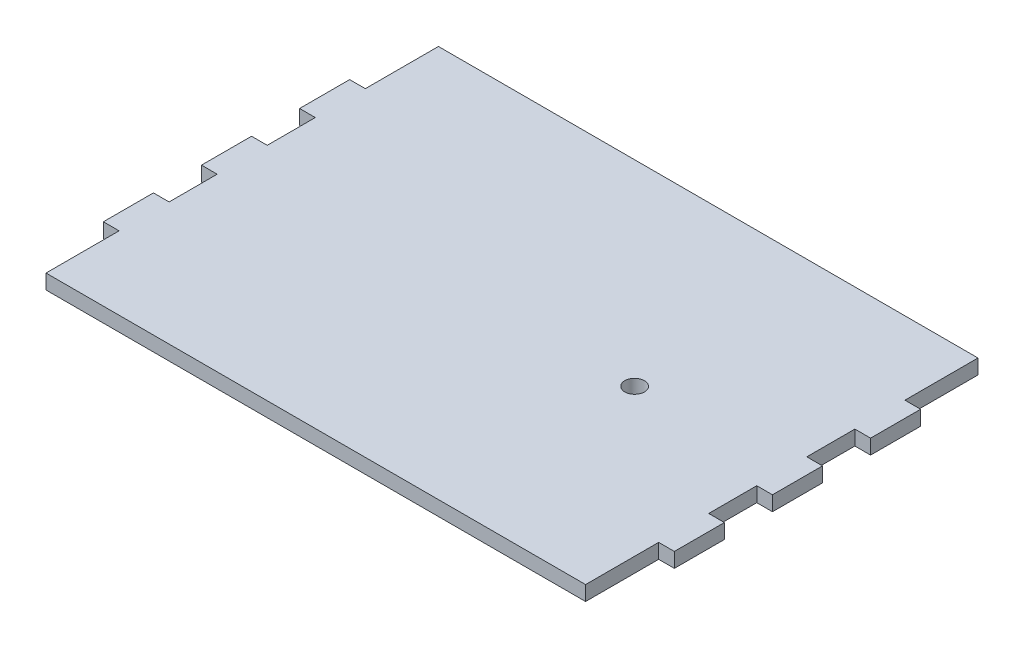
ISO-10303-21;
HEADER;
FILE_DESCRIPTION(('STEP AP214'),'2;1');
FILE_NAME('part.step','',(''),(''),'','','');
FILE_SCHEMA(('AUTOMOTIVE_DESIGN { 1 0 10303 214 1 1 1 1 }'));
ENDSEC;
DATA;
#1=APPLICATION_CONTEXT('core data for automotive mechanical design processes');
#2=APPLICATION_PROTOCOL_DEFINITION('international standard','automotive_design',2000,#1);
#3=PRODUCT_CONTEXT('',#1,'mechanical');
#4=PRODUCT('Part','Part','',(#3));
#5=PRODUCT_RELATED_PRODUCT_CATEGORY('part','',(#4));
#6=PRODUCT_DEFINITION_FORMATION('','',#4);
#7=PRODUCT_DEFINITION_CONTEXT('part definition',#1,'design');
#8=PRODUCT_DEFINITION('design','',#6,#7);
#9=PRODUCT_DEFINITION_SHAPE('','',#8);
#10=(LENGTH_UNIT() NAMED_UNIT(*) SI_UNIT(.MILLI.,.METRE.));
#11=(NAMED_UNIT(*) PLANE_ANGLE_UNIT() SI_UNIT($,.RADIAN.));
#12=(NAMED_UNIT(*) SI_UNIT($,.STERADIAN.) SOLID_ANGLE_UNIT());
#13=UNCERTAINTY_MEASURE_WITH_UNIT(LENGTH_MEASURE(1.E-05),#10,'distance_accuracy_value','');
#14=(GEOMETRIC_REPRESENTATION_CONTEXT(3) GLOBAL_UNCERTAINTY_ASSIGNED_CONTEXT((#13)) GLOBAL_UNIT_ASSIGNED_CONTEXT((#10,
#11,#12)) REPRESENTATION_CONTEXT('',''));
#15=CARTESIAN_POINT('',(0.,0.,0.));
#16=DIRECTION('',(0.,0.,1.));
#17=DIRECTION('',(1.,0.,0.));
#18=AXIS2_PLACEMENT_3D('',#15,#16,#17);
#19=CARTESIAN_POINT('',(0.,3.,0.));
#20=DIRECTION('',(0.,1.,0.));
#21=DIRECTION('',(0.,0.,1.));
#22=AXIS2_PLACEMENT_3D('',#19,#20,#21);
#23=PLANE('',#22);
#24=DIRECTION('',(0.,0.,-1.));
#25=VECTOR('',#24,1.);
#26=CARTESIAN_POINT('',(55.,3.,25.1));
#27=LINE('',#26,#25);
#28=CARTESIAN_POINT('',(55.,3.,40.));
#29=VERTEX_POINT('',#28);
#30=CARTESIAN_POINT('',(55.,3.,25.1));
#31=VERTEX_POINT('',#30);
#32=EDGE_CURVE('E348',#29,#31,#27,.T.);
#33=ORIENTED_EDGE('',*,*,#32,.T.);
#34=DIRECTION('',(1.,0.,0.));
#35=VECTOR('',#34,1.);
#36=CARTESIAN_POINT('',(55.,3.,25.1));
#37=LINE('',#36,#35);
#38=CARTESIAN_POINT('',(58.2,3.,25.1));
#39=VERTEX_POINT('',#38);
#40=EDGE_CURVE('E164',#31,#39,#37,.T.);
#41=ORIENTED_EDGE('',*,*,#40,.T.);
#42=DIRECTION('',(0.,0.,-1.));
#43=VECTOR('',#42,1.);
#44=CARTESIAN_POINT('',(58.2,3.,25.1));
#45=LINE('',#44,#43);
#46=CARTESIAN_POINT('',(58.2,3.,14.9));
#47=VERTEX_POINT('',#46);
#48=EDGE_CURVE('E449',#39,#47,#45,.T.);
#49=ORIENTED_EDGE('',*,*,#48,.T.);
#50=DIRECTION('',(-1.,0.,0.));
#51=VECTOR('',#50,1.);
#52=CARTESIAN_POINT('',(55.,3.,14.9));
#53=LINE('',#52,#51);
#54=CARTESIAN_POINT('',(55.,3.,14.9));
#55=VERTEX_POINT('',#54);
#56=EDGE_CURVE('E469',#47,#55,#53,.T.);
#57=ORIENTED_EDGE('',*,*,#56,.T.);
#58=DIRECTION('',(0.,0.,-1.));
#59=VECTOR('',#58,1.);
#60=CARTESIAN_POINT('',(55.,3.,5.09999999999999));
#61=LINE('',#60,#59);
#62=CARTESIAN_POINT('',(55.,3.,5.09999999999999));
#63=VERTEX_POINT('',#62);
#64=EDGE_CURVE('E465',#55,#63,#61,.T.);
#65=ORIENTED_EDGE('',*,*,#64,.T.);
#66=DIRECTION('',(1.,0.,0.));
#67=VECTOR('',#66,1.);
#68=CARTESIAN_POINT('',(55.,3.,5.09999999999999));
#69=LINE('',#68,#67);
#70=CARTESIAN_POINT('',(58.2,3.,5.09999999999999));
#71=VERTEX_POINT('',#70);
#72=EDGE_CURVE('E468',#63,#71,#69,.T.);
#73=ORIENTED_EDGE('',*,*,#72,.T.);
#74=DIRECTION('',(0.,0.,-1.));
#75=VECTOR('',#74,1.);
#76=CARTESIAN_POINT('',(58.2,3.,-5.10000000000001));
#77=LINE('',#76,#75);
#78=CARTESIAN_POINT('',(58.2,3.,-5.10000000000001));
#79=VERTEX_POINT('',#78);
#80=EDGE_CURVE('E473',#71,#79,#77,.T.);
#81=ORIENTED_EDGE('',*,*,#80,.T.);
#82=DIRECTION('',(-1.,0.,0.));
#83=VECTOR('',#82,1.);
#84=CARTESIAN_POINT('',(55.,3.,-5.1));
#85=LINE('',#84,#83);
#86=CARTESIAN_POINT('',(55.,3.,-5.1));
#87=VERTEX_POINT('',#86);
#88=EDGE_CURVE('E480',#79,#87,#85,.T.);
#89=ORIENTED_EDGE('',*,*,#88,.T.);
#90=DIRECTION('',(0.,0.,-1.));
#91=VECTOR('',#90,1.);
#92=CARTESIAN_POINT('',(55.,3.,-14.9));
#93=LINE('',#92,#91);
#94=CARTESIAN_POINT('',(55.,3.,-14.9));
#95=VERTEX_POINT('',#94);
#96=EDGE_CURVE('E483',#87,#95,#93,.T.);
#97=ORIENTED_EDGE('',*,*,#96,.T.);
#98=DIRECTION('',(1.,0.,0.));
#99=VECTOR('',#98,1.);
#100=CARTESIAN_POINT('',(55.,3.,-14.9));
#101=LINE('',#100,#99);
#102=CARTESIAN_POINT('',(58.2,3.,-14.9));
#103=VERTEX_POINT('',#102);
#104=EDGE_CURVE('E486',#95,#103,#101,.T.);
#105=ORIENTED_EDGE('',*,*,#104,.T.);
#106=DIRECTION('',(0.,0.,-1.));
#107=VECTOR('',#106,1.);
#108=CARTESIAN_POINT('',(58.2,3.,-25.1));
#109=LINE('',#108,#107);
#110=CARTESIAN_POINT('',(58.2,3.,-25.1));
#111=VERTEX_POINT('',#110);
#112=EDGE_CURVE('E489',#103,#111,#109,.T.);
#113=ORIENTED_EDGE('',*,*,#112,.T.);
#114=DIRECTION('',(-1.,0.,0.));
#115=VECTOR('',#114,1.);
#116=CARTESIAN_POINT('',(55.,3.,-25.1));
#117=LINE('',#116,#115);
#118=CARTESIAN_POINT('',(55.,3.,-25.1));
#119=VERTEX_POINT('',#118);
#120=EDGE_CURVE('E492',#111,#119,#117,.T.);
#121=ORIENTED_EDGE('',*,*,#120,.T.);
#122=DIRECTION('',(0.,0.,-1.));
#123=VECTOR('',#122,1.);
#124=CARTESIAN_POINT('',(55.,3.,-40.));
#125=LINE('',#124,#123);
#126=CARTESIAN_POINT('',(55.,3.,-40.));
#127=VERTEX_POINT('',#126);
#128=EDGE_CURVE('E495',#119,#127,#125,.T.);
#129=ORIENTED_EDGE('',*,*,#128,.T.);
#130=DIRECTION('',(-1.,0.,0.));
#131=VECTOR('',#130,1.);
#132=CARTESIAN_POINT('',(-55.,3.,-40.));
#133=LINE('',#132,#131);
#134=CARTESIAN_POINT('',(-55.,3.,-40.));
#135=VERTEX_POINT('',#134);
#136=EDGE_CURVE('E498',#127,#135,#133,.T.);
#137=ORIENTED_EDGE('',*,*,#136,.T.);
#138=DIRECTION('',(0.,0.,1.));
#139=VECTOR('',#138,1.);
#140=CARTESIAN_POINT('',(-55.,3.,-40.));
#141=LINE('',#140,#139);
#142=CARTESIAN_POINT('',(-55.,3.,-25.1));
#143=VERTEX_POINT('',#142);
#144=EDGE_CURVE('E501',#135,#143,#141,.T.);
#145=ORIENTED_EDGE('',*,*,#144,.T.);
#146=DIRECTION('',(-1.,0.,0.));
#147=VECTOR('',#146,1.);
#148=CARTESIAN_POINT('',(-55.,3.,-25.1));
#149=LINE('',#148,#147);
#150=CARTESIAN_POINT('',(-58.2,3.,-25.1));
#151=VERTEX_POINT('',#150);
#152=EDGE_CURVE('E504',#143,#151,#149,.T.);
#153=ORIENTED_EDGE('',*,*,#152,.T.);
#154=DIRECTION('',(0.,0.,1.));
#155=VECTOR('',#154,1.);
#156=CARTESIAN_POINT('',(-58.2,3.,-25.1));
#157=LINE('',#156,#155);
#158=CARTESIAN_POINT('',(-58.2,3.,-14.9));
#159=VERTEX_POINT('',#158);
#160=EDGE_CURVE('E507',#151,#159,#157,.T.);
#161=ORIENTED_EDGE('',*,*,#160,.T.);
#162=DIRECTION('',(1.,0.,0.));
#163=VECTOR('',#162,1.);
#164=CARTESIAN_POINT('',(-55.,3.,-14.9));
#165=LINE('',#164,#163);
#166=CARTESIAN_POINT('',(-55.,3.,-14.9));
#167=VERTEX_POINT('',#166);
#168=EDGE_CURVE('E510',#159,#167,#165,.T.);
#169=ORIENTED_EDGE('',*,*,#168,.T.);
#170=DIRECTION('',(0.,0.,1.));
#171=VECTOR('',#170,1.);
#172=CARTESIAN_POINT('',(-55.,3.,-14.9));
#173=LINE('',#172,#171);
#174=CARTESIAN_POINT('',(-55.,3.,-5.1));
#175=VERTEX_POINT('',#174);
#176=EDGE_CURVE('E513',#167,#175,#173,.T.);
#177=ORIENTED_EDGE('',*,*,#176,.T.);
#178=DIRECTION('',(-1.,0.,0.));
#179=VECTOR('',#178,1.);
#180=CARTESIAN_POINT('',(-55.,3.,-5.1));
#181=LINE('',#180,#179);
#182=CARTESIAN_POINT('',(-58.2,3.,-5.10000000000001));
#183=VERTEX_POINT('',#182);
#184=EDGE_CURVE('E516',#175,#183,#181,.T.);
#185=ORIENTED_EDGE('',*,*,#184,.T.);
#186=DIRECTION('',(0.,0.,1.));
#187=VECTOR('',#186,1.);
#188=CARTESIAN_POINT('',(-58.2,3.,-5.10000000000001));
#189=LINE('',#188,#187);
#190=CARTESIAN_POINT('',(-58.2,3.,5.09999999999999));
#191=VERTEX_POINT('',#190);
#192=EDGE_CURVE('E519',#183,#191,#189,.T.);
#193=ORIENTED_EDGE('',*,*,#192,.T.);
#194=DIRECTION('',(1.,0.,0.));
#195=VECTOR('',#194,1.);
#196=CARTESIAN_POINT('',(-55.,3.,5.09999999999999));
#197=LINE('',#196,#195);
#198=CARTESIAN_POINT('',(-55.,3.,5.09999999999999));
#199=VERTEX_POINT('',#198);
#200=EDGE_CURVE('E522',#191,#199,#197,.T.);
#201=ORIENTED_EDGE('',*,*,#200,.T.);
#202=DIRECTION('',(0.,0.,1.));
#203=VECTOR('',#202,1.);
#204=CARTESIAN_POINT('',(-55.,3.,5.09999999999999));
#205=LINE('',#204,#203);
#206=CARTESIAN_POINT('',(-55.,3.,14.9));
#207=VERTEX_POINT('',#206);
#208=EDGE_CURVE('E525',#199,#207,#205,.T.);
#209=ORIENTED_EDGE('',*,*,#208,.T.);
#210=DIRECTION('',(-1.,0.,0.));
#211=VECTOR('',#210,1.);
#212=CARTESIAN_POINT('',(-55.,3.,14.9));
#213=LINE('',#212,#211);
#214=CARTESIAN_POINT('',(-58.2,3.,14.9));
#215=VERTEX_POINT('',#214);
#216=EDGE_CURVE('E528',#207,#215,#213,.T.);
#217=ORIENTED_EDGE('',*,*,#216,.T.);
#218=DIRECTION('',(0.,0.,1.));
#219=VECTOR('',#218,1.);
#220=CARTESIAN_POINT('',(-58.2,3.,25.1));
#221=LINE('',#220,#219);
#222=CARTESIAN_POINT('',(-58.2,3.,25.1));
#223=VERTEX_POINT('',#222);
#224=EDGE_CURVE('E243',#215,#223,#221,.T.);
#225=ORIENTED_EDGE('',*,*,#224,.T.);
#226=DIRECTION('',(1.,0.,0.));
#227=VECTOR('',#226,1.);
#228=CARTESIAN_POINT('',(-55.,3.,25.1));
#229=LINE('',#228,#227);
#230=CARTESIAN_POINT('',(-55.,3.,25.1));
#231=VERTEX_POINT('',#230);
#232=EDGE_CURVE('E237',#223,#231,#229,.T.);
#233=ORIENTED_EDGE('',*,*,#232,.T.);
#234=DIRECTION('',(0.,0.,1.));
#235=VECTOR('',#234,1.);
#236=CARTESIAN_POINT('',(-55.,3.,25.1));
#237=LINE('',#236,#235);
#238=CARTESIAN_POINT('',(-55.,3.,40.));
#239=VERTEX_POINT('',#238);
#240=EDGE_CURVE('E241',#231,#239,#237,.T.);
#241=ORIENTED_EDGE('',*,*,#240,.T.);
#242=DIRECTION('',(1.,0.,0.));
#243=VECTOR('',#242,1.);
#244=CARTESIAN_POINT('',(-55.,3.,40.));
#245=LINE('',#244,#243);
#246=EDGE_CURVE('E61',#239,#29,#245,.T.);
#247=ORIENTED_EDGE('',*,*,#246,.T.);
#248=EDGE_LOOP('',(#33,#41,#49,#57,#65,#73,#81,#89,#97,#105,#113,#121,#129,#137,#145,#153,#161,
#169,#177,#185,#193,#201,#209,#217,#225,#233,#241,#247));
#249=FACE_BOUND('',#248,.T.);
#250=CARTESIAN_POINT('',(25.,3.,0.));
#251=DIRECTION('',(0.,1.,0.));
#252=DIRECTION('',(0.,0.,1.));
#253=AXIS2_PLACEMENT_3D('',#250,#251,#252);
#254=CIRCLE('',#253,2.);
#255=CARTESIAN_POINT('',(25.,3.,2.));
#256=VERTEX_POINT('',#255);
#257=EDGE_CURVE('E270',#256,#256,#254,.T.);
#258=ORIENTED_EDGE('',*,*,#257,.F.);
#259=EDGE_LOOP('',(#258));
#260=FACE_BOUND('',#259,.T.);
#261=ADVANCED_FACE('F43',(#249,#260),#23,.T.);
#262=CARTESIAN_POINT('',(0.,0.,0.));
#263=DIRECTION('',(0.,1.,0.));
#264=DIRECTION('',(0.,0.,1.));
#265=AXIS2_PLACEMENT_3D('',#262,#263,#264);
#266=PLANE('',#265);
#267=DIRECTION('',(0.,0.,-1.));
#268=VECTOR('',#267,1.);
#269=CARTESIAN_POINT('',(55.,0.,25.1));
#270=LINE('',#269,#268);
#271=CARTESIAN_POINT('',(55.,0.,40.));
#272=VERTEX_POINT('',#271);
#273=CARTESIAN_POINT('',(55.,0.,25.1));
#274=VERTEX_POINT('',#273);
#275=EDGE_CURVE('E265',#272,#274,#270,.T.);
#276=ORIENTED_EDGE('',*,*,#275,.F.);
#277=DIRECTION('',(1.,0.,0.));
#278=VECTOR('',#277,1.);
#279=CARTESIAN_POINT('',(-55.,0.,40.));
#280=LINE('',#279,#278);
#281=CARTESIAN_POINT('',(-55.,0.,40.));
#282=VERTEX_POINT('',#281);
#283=EDGE_CURVE('E156',#282,#272,#280,.T.);
#284=ORIENTED_EDGE('',*,*,#283,.F.);
#285=DIRECTION('',(0.,0.,1.));
#286=VECTOR('',#285,1.);
#287=CARTESIAN_POINT('',(-55.,0.,25.1));
#288=LINE('',#287,#286);
#289=CARTESIAN_POINT('',(-55.,0.,25.1));
#290=VERTEX_POINT('',#289);
#291=EDGE_CURVE('E150',#290,#282,#288,.T.);
#292=ORIENTED_EDGE('',*,*,#291,.F.);
#293=DIRECTION('',(1.,0.,0.));
#294=VECTOR('',#293,1.);
#295=CARTESIAN_POINT('',(-55.,0.,25.1));
#296=LINE('',#295,#294);
#297=CARTESIAN_POINT('',(-58.2,0.,25.1));
#298=VERTEX_POINT('',#297);
#299=EDGE_CURVE('E252',#298,#290,#296,.T.);
#300=ORIENTED_EDGE('',*,*,#299,.F.);
#301=DIRECTION('',(0.,0.,1.));
#302=VECTOR('',#301,1.);
#303=CARTESIAN_POINT('',(-58.2,0.,25.1));
#304=LINE('',#303,#302);
#305=CARTESIAN_POINT('',(-58.2,0.,14.9));
#306=VERTEX_POINT('',#305);
#307=EDGE_CURVE('E339',#306,#298,#304,.T.);
#308=ORIENTED_EDGE('',*,*,#307,.F.);
#309=DIRECTION('',(-1.,0.,0.));
#310=VECTOR('',#309,1.);
#311=CARTESIAN_POINT('',(-55.,0.,14.9));
#312=LINE('',#311,#310);
#313=CARTESIAN_POINT('',(-55.,0.,14.9));
#314=VERTEX_POINT('',#313);
#315=EDGE_CURVE('E336',#314,#306,#312,.T.);
#316=ORIENTED_EDGE('',*,*,#315,.F.);
#317=DIRECTION('',(0.,0.,1.));
#318=VECTOR('',#317,1.);
#319=CARTESIAN_POINT('',(-55.,0.,5.09999999999999));
#320=LINE('',#319,#318);
#321=CARTESIAN_POINT('',(-55.,0.,5.09999999999999));
#322=VERTEX_POINT('',#321);
#323=EDGE_CURVE('E333',#322,#314,#320,.T.);
#324=ORIENTED_EDGE('',*,*,#323,.F.);
#325=DIRECTION('',(1.,0.,0.));
#326=VECTOR('',#325,1.);
#327=CARTESIAN_POINT('',(-55.,0.,5.09999999999999));
#328=LINE('',#327,#326);
#329=CARTESIAN_POINT('',(-58.2,0.,5.09999999999999));
#330=VERTEX_POINT('',#329);
#331=EDGE_CURVE('E330',#330,#322,#328,.T.);
#332=ORIENTED_EDGE('',*,*,#331,.F.);
#333=DIRECTION('',(0.,0.,1.));
#334=VECTOR('',#333,1.);
#335=CARTESIAN_POINT('',(-58.2,0.,-5.10000000000001));
#336=LINE('',#335,#334);
#337=CARTESIAN_POINT('',(-58.2,0.,-5.10000000000001));
#338=VERTEX_POINT('',#337);
#339=EDGE_CURVE('E327',#338,#330,#336,.T.);
#340=ORIENTED_EDGE('',*,*,#339,.F.);
#341=DIRECTION('',(-1.,0.,0.));
#342=VECTOR('',#341,1.);
#343=CARTESIAN_POINT('',(-55.,0.,-5.1));
#344=LINE('',#343,#342);
#345=CARTESIAN_POINT('',(-55.,0.,-5.1));
#346=VERTEX_POINT('',#345);
#347=EDGE_CURVE('E324',#346,#338,#344,.T.);
#348=ORIENTED_EDGE('',*,*,#347,.F.);
#349=DIRECTION('',(0.,0.,1.));
#350=VECTOR('',#349,1.);
#351=CARTESIAN_POINT('',(-55.,0.,-14.9));
#352=LINE('',#351,#350);
#353=CARTESIAN_POINT('',(-55.,0.,-14.9));
#354=VERTEX_POINT('',#353);
#355=EDGE_CURVE('E321',#354,#346,#352,.T.);
#356=ORIENTED_EDGE('',*,*,#355,.F.);
#357=DIRECTION('',(1.,0.,0.));
#358=VECTOR('',#357,1.);
#359=CARTESIAN_POINT('',(-55.,0.,-14.9));
#360=LINE('',#359,#358);
#361=CARTESIAN_POINT('',(-58.2,0.,-14.9));
#362=VERTEX_POINT('',#361);
#363=EDGE_CURVE('E318',#362,#354,#360,.T.);
#364=ORIENTED_EDGE('',*,*,#363,.F.);
#365=DIRECTION('',(0.,0.,1.));
#366=VECTOR('',#365,1.);
#367=CARTESIAN_POINT('',(-58.2,0.,-25.1));
#368=LINE('',#367,#366);
#369=CARTESIAN_POINT('',(-58.2,0.,-25.1));
#370=VERTEX_POINT('',#369);
#371=EDGE_CURVE('E315',#370,#362,#368,.T.);
#372=ORIENTED_EDGE('',*,*,#371,.F.);
#373=DIRECTION('',(-1.,0.,0.));
#374=VECTOR('',#373,1.);
#375=CARTESIAN_POINT('',(-55.,0.,-25.1));
#376=LINE('',#375,#374);
#377=CARTESIAN_POINT('',(-55.,0.,-25.1));
#378=VERTEX_POINT('',#377);
#379=EDGE_CURVE('E312',#378,#370,#376,.T.);
#380=ORIENTED_EDGE('',*,*,#379,.F.);
#381=DIRECTION('',(0.,0.,1.));
#382=VECTOR('',#381,1.);
#383=CARTESIAN_POINT('',(-55.,0.,-40.));
#384=LINE('',#383,#382);
#385=CARTESIAN_POINT('',(-55.,0.,-40.));
#386=VERTEX_POINT('',#385);
#387=EDGE_CURVE('E309',#386,#378,#384,.T.);
#388=ORIENTED_EDGE('',*,*,#387,.F.);
#389=DIRECTION('',(-1.,0.,0.));
#390=VECTOR('',#389,1.);
#391=CARTESIAN_POINT('',(-55.,0.,-40.));
#392=LINE('',#391,#390);
#393=CARTESIAN_POINT('',(55.,0.,-40.));
#394=VERTEX_POINT('',#393);
#395=EDGE_CURVE('E306',#394,#386,#392,.T.);
#396=ORIENTED_EDGE('',*,*,#395,.F.);
#397=DIRECTION('',(0.,0.,-1.));
#398=VECTOR('',#397,1.);
#399=CARTESIAN_POINT('',(55.,0.,-40.));
#400=LINE('',#399,#398);
#401=CARTESIAN_POINT('',(55.,0.,-25.1));
#402=VERTEX_POINT('',#401);
#403=EDGE_CURVE('E303',#402,#394,#400,.T.);
#404=ORIENTED_EDGE('',*,*,#403,.F.);
#405=DIRECTION('',(-1.,0.,0.));
#406=VECTOR('',#405,1.);
#407=CARTESIAN_POINT('',(55.,0.,-25.1));
#408=LINE('',#407,#406);
#409=CARTESIAN_POINT('',(58.2,0.,-25.1));
#410=VERTEX_POINT('',#409);
#411=EDGE_CURVE('E300',#410,#402,#408,.T.);
#412=ORIENTED_EDGE('',*,*,#411,.F.);
#413=DIRECTION('',(0.,0.,-1.));
#414=VECTOR('',#413,1.);
#415=CARTESIAN_POINT('',(58.2,0.,-25.1));
#416=LINE('',#415,#414);
#417=CARTESIAN_POINT('',(58.2,0.,-14.9));
#418=VERTEX_POINT('',#417);
#419=EDGE_CURVE('E297',#418,#410,#416,.T.);
#420=ORIENTED_EDGE('',*,*,#419,.F.);
#421=DIRECTION('',(1.,0.,0.));
#422=VECTOR('',#421,1.);
#423=CARTESIAN_POINT('',(55.,0.,-14.9));
#424=LINE('',#423,#422);
#425=CARTESIAN_POINT('',(55.,0.,-14.9));
#426=VERTEX_POINT('',#425);
#427=EDGE_CURVE('E294',#426,#418,#424,.T.);
#428=ORIENTED_EDGE('',*,*,#427,.F.);
#429=DIRECTION('',(0.,0.,-1.));
#430=VECTOR('',#429,1.);
#431=CARTESIAN_POINT('',(55.,0.,-14.9));
#432=LINE('',#431,#430);
#433=CARTESIAN_POINT('',(55.,0.,-5.1));
#434=VERTEX_POINT('',#433);
#435=EDGE_CURVE('E291',#434,#426,#432,.T.);
#436=ORIENTED_EDGE('',*,*,#435,.F.);
#437=DIRECTION('',(-1.,0.,0.));
#438=VECTOR('',#437,1.);
#439=CARTESIAN_POINT('',(55.,0.,-5.1));
#440=LINE('',#439,#438);
#441=CARTESIAN_POINT('',(58.2,0.,-5.10000000000001));
#442=VERTEX_POINT('',#441);
#443=EDGE_CURVE('E288',#442,#434,#440,.T.);
#444=ORIENTED_EDGE('',*,*,#443,.F.);
#445=DIRECTION('',(0.,0.,-1.));
#446=VECTOR('',#445,1.);
#447=CARTESIAN_POINT('',(58.2,0.,-5.10000000000001));
#448=LINE('',#447,#446);
#449=CARTESIAN_POINT('',(58.2,0.,5.09999999999999));
#450=VERTEX_POINT('',#449);
#451=EDGE_CURVE('E285',#450,#442,#448,.T.);
#452=ORIENTED_EDGE('',*,*,#451,.F.);
#453=DIRECTION('',(1.,0.,0.));
#454=VECTOR('',#453,1.);
#455=CARTESIAN_POINT('',(55.,0.,5.09999999999999));
#456=LINE('',#455,#454);
#457=CARTESIAN_POINT('',(55.,0.,5.09999999999999));
#458=VERTEX_POINT('',#457);
#459=EDGE_CURVE('E282',#458,#450,#456,.T.);
#460=ORIENTED_EDGE('',*,*,#459,.F.);
#461=DIRECTION('',(0.,0.,-1.));
#462=VECTOR('',#461,1.);
#463=CARTESIAN_POINT('',(55.,0.,5.09999999999999));
#464=LINE('',#463,#462);
#465=CARTESIAN_POINT('',(55.,0.,14.9));
#466=VERTEX_POINT('',#465);
#467=EDGE_CURVE('E279',#466,#458,#464,.T.);
#468=ORIENTED_EDGE('',*,*,#467,.F.);
#469=DIRECTION('',(-1.,0.,0.));
#470=VECTOR('',#469,1.);
#471=CARTESIAN_POINT('',(55.,0.,14.9));
#472=LINE('',#471,#470);
#473=CARTESIAN_POINT('',(58.2,0.,14.9));
#474=VERTEX_POINT('',#473);
#475=EDGE_CURVE('E276',#474,#466,#472,.T.);
#476=ORIENTED_EDGE('',*,*,#475,.F.);
#477=DIRECTION('',(0.,0.,-1.));
#478=VECTOR('',#477,1.);
#479=CARTESIAN_POINT('',(58.2,0.,25.1));
#480=LINE('',#479,#478);
#481=CARTESIAN_POINT('',(58.2,0.,25.1));
#482=VERTEX_POINT('',#481);
#483=EDGE_CURVE('E273',#482,#474,#480,.T.);
#484=ORIENTED_EDGE('',*,*,#483,.F.);
#485=DIRECTION('',(1.,0.,0.));
#486=VECTOR('',#485,1.);
#487=CARTESIAN_POINT('',(55.,0.,25.1));
#488=LINE('',#487,#486);
#489=EDGE_CURVE('E269',#274,#482,#488,.T.);
#490=ORIENTED_EDGE('',*,*,#489,.F.);
#491=EDGE_LOOP('',(#276,#284,#292,#300,#308,#316,#324,#332,#340,#348,#356,#364,#372,#380,#388,
#396,#404,#412,#420,#428,#436,#444,#452,#460,#468,#476,#484,#490));
#492=FACE_BOUND('',#491,.T.);
#493=CARTESIAN_POINT('',(25.,0.,0.));
#494=DIRECTION('',(0.,1.,0.));
#495=DIRECTION('',(0.,0.,1.));
#496=AXIS2_PLACEMENT_3D('',#493,#494,#495);
#497=CIRCLE('',#496,2.);
#498=CARTESIAN_POINT('',(25.,0.,2.));
#499=VERTEX_POINT('',#498);
#500=EDGE_CURVE('E947',#499,#499,#497,.T.);
#501=ORIENTED_EDGE('',*,*,#500,.T.);
#502=EDGE_LOOP('',(#501));
#503=FACE_BOUND('',#502,.T.);
#504=ADVANCED_FACE('F453',(#492,#503),#266,.F.);
#505=CARTESIAN_POINT('',(55.,3.,25.1));
#506=DIRECTION('',(-1.,0.,0.));
#507=DIRECTION('',(0.,0.,1.));
#508=AXIS2_PLACEMENT_3D('',#505,#506,#507);
#509=PLANE('',#508);
#510=ORIENTED_EDGE('',*,*,#275,.T.);
#511=DIRECTION('',(0.,-1.,0.));
#512=VECTOR('',#511,1.);
#513=CARTESIAN_POINT('',(55.,3.,25.1));
#514=LINE('',#513,#512);
#515=EDGE_CURVE('E11',#31,#274,#514,.T.);
#516=ORIENTED_EDGE('',*,*,#515,.F.);
#517=ORIENTED_EDGE('',*,*,#32,.F.);
#518=DIRECTION('',(0.,-1.,0.));
#519=VECTOR('',#518,1.);
#520=CARTESIAN_POINT('',(55.,3.,40.));
#521=LINE('',#520,#519);
#522=EDGE_CURVE('E261',#29,#272,#521,.T.);
#523=ORIENTED_EDGE('',*,*,#522,.T.);
#524=EDGE_LOOP('',(#510,#516,#517,#523));
#525=FACE_BOUND('',#524,.T.);
#526=ADVANCED_FACE('F45',(#525),#509,.F.);
#527=CARTESIAN_POINT('',(55.,3.,25.1));
#528=DIRECTION('',(0.,0.,-1.));
#529=DIRECTION('',(-1.,0.,0.));
#530=AXIS2_PLACEMENT_3D('',#527,#528,#529);
#531=PLANE('',#530);
#532=ORIENTED_EDGE('',*,*,#489,.T.);
#533=DIRECTION('',(0.,-1.,0.));
#534=VECTOR('',#533,1.);
#535=CARTESIAN_POINT('',(58.2,3.,25.1));
#536=LINE('',#535,#534);
#537=EDGE_CURVE('E53',#39,#482,#536,.T.);
#538=ORIENTED_EDGE('',*,*,#537,.F.);
#539=ORIENTED_EDGE('',*,*,#40,.F.);
#540=ORIENTED_EDGE('',*,*,#515,.T.);
#541=EDGE_LOOP('',(#532,#538,#539,#540));
#542=FACE_BOUND('',#541,.T.);
#543=ADVANCED_FACE('F564',(#542),#531,.F.);
#544=CARTESIAN_POINT('',(58.2,3.,25.1));
#545=DIRECTION('',(-1.,0.,0.));
#546=DIRECTION('',(0.,0.,1.));
#547=AXIS2_PLACEMENT_3D('',#544,#545,#546);
#548=PLANE('',#547);
#549=ORIENTED_EDGE('',*,*,#483,.T.);
#550=DIRECTION('',(0.,-1.,0.));
#551=VECTOR('',#550,1.);
#552=CARTESIAN_POINT('',(58.2,3.,14.9));
#553=LINE('',#552,#551);
#554=EDGE_CURVE('E439',#47,#474,#553,.T.);
#555=ORIENTED_EDGE('',*,*,#554,.F.);
#556=ORIENTED_EDGE('',*,*,#48,.F.);
#557=ORIENTED_EDGE('',*,*,#537,.T.);
#558=EDGE_LOOP('',(#549,#555,#556,#557));
#559=FACE_BOUND('',#558,.T.);
#560=ADVANCED_FACE('F447',(#559),#548,.F.);
#561=CARTESIAN_POINT('',(55.,3.,14.9));
#562=DIRECTION('',(0.,0.,1.));
#563=DIRECTION('',(1.,0.,0.));
#564=AXIS2_PLACEMENT_3D('',#561,#562,#563);
#565=PLANE('',#564);
#566=ORIENTED_EDGE('',*,*,#475,.T.);
#567=DIRECTION('',(0.,-1.,0.));
#568=VECTOR('',#567,1.);
#569=CARTESIAN_POINT('',(55.,3.,14.9));
#570=LINE('',#569,#568);
#571=EDGE_CURVE('E435',#55,#466,#570,.T.);
#572=ORIENTED_EDGE('',*,*,#571,.F.);
#573=ORIENTED_EDGE('',*,*,#56,.F.);
#574=ORIENTED_EDGE('',*,*,#554,.T.);
#575=EDGE_LOOP('',(#566,#572,#573,#574));
#576=FACE_BOUND('',#575,.T.);
#577=ADVANCED_FACE('F459',(#576),#565,.F.);
#578=CARTESIAN_POINT('',(55.,3.,5.09999999999999));
#579=DIRECTION('',(-1.,0.,0.));
#580=DIRECTION('',(0.,0.,1.));
#581=AXIS2_PLACEMENT_3D('',#578,#579,#580);
#582=PLANE('',#581);
#583=ORIENTED_EDGE('',*,*,#467,.T.);
#584=DIRECTION('',(0.,-1.,0.));
#585=VECTOR('',#584,1.);
#586=CARTESIAN_POINT('',(55.,3.,5.09999999999999));
#587=LINE('',#586,#585);
#588=EDGE_CURVE('E431',#63,#458,#587,.T.);
#589=ORIENTED_EDGE('',*,*,#588,.F.);
#590=ORIENTED_EDGE('',*,*,#64,.F.);
#591=ORIENTED_EDGE('',*,*,#571,.T.);
#592=EDGE_LOOP('',(#583,#589,#590,#591));
#593=FACE_BOUND('',#592,.T.);
#594=ADVANCED_FACE('F463',(#593),#582,.F.);
#595=CARTESIAN_POINT('',(55.,3.,5.09999999999999));
#596=DIRECTION('',(0.,0.,-1.));
#597=DIRECTION('',(-1.,0.,0.));
#598=AXIS2_PLACEMENT_3D('',#595,#596,#597);
#599=PLANE('',#598);
#600=ORIENTED_EDGE('',*,*,#459,.T.);
#601=DIRECTION('',(0.,-1.,0.));
#602=VECTOR('',#601,1.);
#603=CARTESIAN_POINT('',(58.2,3.,5.09999999999999));
#604=LINE('',#603,#602);
#605=EDGE_CURVE('E427',#71,#450,#604,.T.);
#606=ORIENTED_EDGE('',*,*,#605,.F.);
#607=ORIENTED_EDGE('',*,*,#72,.F.);
#608=ORIENTED_EDGE('',*,*,#588,.T.);
#609=EDGE_LOOP('',(#600,#606,#607,#608));
#610=FACE_BOUND('',#609,.T.);
#611=ADVANCED_FACE('F577',(#610),#599,.F.);
#612=CARTESIAN_POINT('',(58.2,3.,-5.10000000000001));
#613=DIRECTION('',(-1.,0.,0.));
#614=DIRECTION('',(0.,0.,1.));
#615=AXIS2_PLACEMENT_3D('',#612,#613,#614);
#616=PLANE('',#615);
#617=ORIENTED_EDGE('',*,*,#451,.T.);
#618=DIRECTION('',(0.,-1.,0.));
#619=VECTOR('',#618,1.);
#620=CARTESIAN_POINT('',(58.2,3.,-5.10000000000001));
#621=LINE('',#620,#619);
#622=EDGE_CURVE('E423',#79,#442,#621,.T.);
#623=ORIENTED_EDGE('',*,*,#622,.F.);
#624=ORIENTED_EDGE('',*,*,#80,.F.);
#625=ORIENTED_EDGE('',*,*,#605,.T.);
#626=EDGE_LOOP('',(#617,#623,#624,#625));
#627=FACE_BOUND('',#626,.T.);
#628=ADVANCED_FACE('F580',(#627),#616,.F.);
#629=CARTESIAN_POINT('',(55.,3.,-5.1));
#630=DIRECTION('',(0.,0.,1.));
#631=DIRECTION('',(1.,0.,0.));
#632=AXIS2_PLACEMENT_3D('',#629,#630,#631);
#633=PLANE('',#632);
#634=ORIENTED_EDGE('',*,*,#443,.T.);
#635=DIRECTION('',(0.,-1.,0.));
#636=VECTOR('',#635,1.);
#637=CARTESIAN_POINT('',(55.,3.,-5.1));
#638=LINE('',#637,#636);
#639=EDGE_CURVE('E419',#87,#434,#638,.T.);
#640=ORIENTED_EDGE('',*,*,#639,.F.);
#641=ORIENTED_EDGE('',*,*,#88,.F.);
#642=ORIENTED_EDGE('',*,*,#622,.T.);
#643=EDGE_LOOP('',(#634,#640,#641,#642));
#644=FACE_BOUND('',#643,.T.);
#645=ADVANCED_FACE('F584',(#644),#633,.F.);
#646=CARTESIAN_POINT('',(55.,3.,-14.9));
#647=DIRECTION('',(-1.,0.,0.));
#648=DIRECTION('',(0.,0.,1.));
#649=AXIS2_PLACEMENT_3D('',#646,#647,#648);
#650=PLANE('',#649);
#651=ORIENTED_EDGE('',*,*,#435,.T.);
#652=DIRECTION('',(0.,-1.,0.));
#653=VECTOR('',#652,1.);
#654=CARTESIAN_POINT('',(55.,3.,-14.9));
#655=LINE('',#654,#653);
#656=EDGE_CURVE('E415',#95,#426,#655,.T.);
#657=ORIENTED_EDGE('',*,*,#656,.F.);
#658=ORIENTED_EDGE('',*,*,#96,.F.);
#659=ORIENTED_EDGE('',*,*,#639,.T.);
#660=EDGE_LOOP('',(#651,#657,#658,#659));
#661=FACE_BOUND('',#660,.T.);
#662=ADVANCED_FACE('F588',(#661),#650,.F.);
#663=CARTESIAN_POINT('',(55.,3.,-14.9));
#664=DIRECTION('',(0.,0.,-1.));
#665=DIRECTION('',(-1.,0.,0.));
#666=AXIS2_PLACEMENT_3D('',#663,#664,#665);
#667=PLANE('',#666);
#668=ORIENTED_EDGE('',*,*,#427,.T.);
#669=DIRECTION('',(0.,-1.,0.));
#670=VECTOR('',#669,1.);
#671=CARTESIAN_POINT('',(58.2,3.,-14.9));
#672=LINE('',#671,#670);
#673=EDGE_CURVE('E411',#103,#418,#672,.T.);
#674=ORIENTED_EDGE('',*,*,#673,.F.);
#675=ORIENTED_EDGE('',*,*,#104,.F.);
#676=ORIENTED_EDGE('',*,*,#656,.T.);
#677=EDGE_LOOP('',(#668,#674,#675,#676));
#678=FACE_BOUND('',#677,.T.);
#679=ADVANCED_FACE('F592',(#678),#667,.F.);
#680=CARTESIAN_POINT('',(58.2,3.,-25.1));
#681=DIRECTION('',(-1.,0.,0.));
#682=DIRECTION('',(0.,0.,1.));
#683=AXIS2_PLACEMENT_3D('',#680,#681,#682);
#684=PLANE('',#683);
#685=ORIENTED_EDGE('',*,*,#419,.T.);
#686=DIRECTION('',(0.,-1.,0.));
#687=VECTOR('',#686,1.);
#688=CARTESIAN_POINT('',(58.2,3.,-25.1));
#689=LINE('',#688,#687);
#690=EDGE_CURVE('E407',#111,#410,#689,.T.);
#691=ORIENTED_EDGE('',*,*,#690,.F.);
#692=ORIENTED_EDGE('',*,*,#112,.F.);
#693=ORIENTED_EDGE('',*,*,#673,.T.);
#694=EDGE_LOOP('',(#685,#691,#692,#693));
#695=FACE_BOUND('',#694,.T.);
#696=ADVANCED_FACE('F596',(#695),#684,.F.);
#697=CARTESIAN_POINT('',(55.,3.,-25.1));
#698=DIRECTION('',(0.,0.,1.));
#699=DIRECTION('',(1.,0.,0.));
#700=AXIS2_PLACEMENT_3D('',#697,#698,#699);
#701=PLANE('',#700);
#702=ORIENTED_EDGE('',*,*,#411,.T.);
#703=DIRECTION('',(0.,-1.,0.));
#704=VECTOR('',#703,1.);
#705=CARTESIAN_POINT('',(55.,3.,-25.1));
#706=LINE('',#705,#704);
#707=EDGE_CURVE('E403',#119,#402,#706,.T.);
#708=ORIENTED_EDGE('',*,*,#707,.F.);
#709=ORIENTED_EDGE('',*,*,#120,.F.);
#710=ORIENTED_EDGE('',*,*,#690,.T.);
#711=EDGE_LOOP('',(#702,#708,#709,#710));
#712=FACE_BOUND('',#711,.T.);
#713=ADVANCED_FACE('F600',(#712),#701,.F.);
#714=CARTESIAN_POINT('',(55.,3.,-40.));
#715=DIRECTION('',(-1.,0.,0.));
#716=DIRECTION('',(0.,0.,1.));
#717=AXIS2_PLACEMENT_3D('',#714,#715,#716);
#718=PLANE('',#717);
#719=ORIENTED_EDGE('',*,*,#403,.T.);
#720=DIRECTION('',(0.,-1.,0.));
#721=VECTOR('',#720,1.);
#722=CARTESIAN_POINT('',(55.,3.,-40.));
#723=LINE('',#722,#721);
#724=EDGE_CURVE('E399',#127,#394,#723,.T.);
#725=ORIENTED_EDGE('',*,*,#724,.F.);
#726=ORIENTED_EDGE('',*,*,#128,.F.);
#727=ORIENTED_EDGE('',*,*,#707,.T.);
#728=EDGE_LOOP('',(#719,#725,#726,#727));
#729=FACE_BOUND('',#728,.T.);
#730=ADVANCED_FACE('F604',(#729),#718,.F.);
#731=CARTESIAN_POINT('',(-55.,3.,-40.));
#732=DIRECTION('',(0.,0.,1.));
#733=DIRECTION('',(1.,0.,0.));
#734=AXIS2_PLACEMENT_3D('',#731,#732,#733);
#735=PLANE('',#734);
#736=ORIENTED_EDGE('',*,*,#395,.T.);
#737=DIRECTION('',(0.,-1.,0.));
#738=VECTOR('',#737,1.);
#739=CARTESIAN_POINT('',(-55.,3.,-40.));
#740=LINE('',#739,#738);
#741=EDGE_CURVE('E395',#135,#386,#740,.T.);
#742=ORIENTED_EDGE('',*,*,#741,.F.);
#743=ORIENTED_EDGE('',*,*,#136,.F.);
#744=ORIENTED_EDGE('',*,*,#724,.T.);
#745=EDGE_LOOP('',(#736,#742,#743,#744));
#746=FACE_BOUND('',#745,.T.);
#747=ADVANCED_FACE('F608',(#746),#735,.F.);
#748=CARTESIAN_POINT('',(-55.,3.,-40.));
#749=DIRECTION('',(1.,0.,0.));
#750=DIRECTION('',(0.,0.,-1.));
#751=AXIS2_PLACEMENT_3D('',#748,#749,#750);
#752=PLANE('',#751);
#753=ORIENTED_EDGE('',*,*,#387,.T.);
#754=DIRECTION('',(0.,-1.,0.));
#755=VECTOR('',#754,1.);
#756=CARTESIAN_POINT('',(-55.,3.,-25.1));
#757=LINE('',#756,#755);
#758=EDGE_CURVE('E391',#143,#378,#757,.T.);
#759=ORIENTED_EDGE('',*,*,#758,.F.);
#760=ORIENTED_EDGE('',*,*,#144,.F.);
#761=ORIENTED_EDGE('',*,*,#741,.T.);
#762=EDGE_LOOP('',(#753,#759,#760,#761));
#763=FACE_BOUND('',#762,.T.);
#764=ADVANCED_FACE('F612',(#763),#752,.F.);
#765=CARTESIAN_POINT('',(-55.,3.,-25.1));
#766=DIRECTION('',(0.,0.,1.));
#767=DIRECTION('',(1.,0.,0.));
#768=AXIS2_PLACEMENT_3D('',#765,#766,#767);
#769=PLANE('',#768);
#770=ORIENTED_EDGE('',*,*,#379,.T.);
#771=DIRECTION('',(0.,-1.,0.));
#772=VECTOR('',#771,1.);
#773=CARTESIAN_POINT('',(-58.2,3.,-25.1));
#774=LINE('',#773,#772);
#775=EDGE_CURVE('E387',#151,#370,#774,.T.);
#776=ORIENTED_EDGE('',*,*,#775,.F.);
#777=ORIENTED_EDGE('',*,*,#152,.F.);
#778=ORIENTED_EDGE('',*,*,#758,.T.);
#779=EDGE_LOOP('',(#770,#776,#777,#778));
#780=FACE_BOUND('',#779,.T.);
#781=ADVANCED_FACE('F616',(#780),#769,.F.);
#782=CARTESIAN_POINT('',(-58.2,3.,-25.1));
#783=DIRECTION('',(1.,0.,0.));
#784=DIRECTION('',(0.,0.,-1.));
#785=AXIS2_PLACEMENT_3D('',#782,#783,#784);
#786=PLANE('',#785);
#787=ORIENTED_EDGE('',*,*,#371,.T.);
#788=DIRECTION('',(0.,-1.,0.));
#789=VECTOR('',#788,1.);
#790=CARTESIAN_POINT('',(-58.2,3.,-14.9));
#791=LINE('',#790,#789);
#792=EDGE_CURVE('E383',#159,#362,#791,.T.);
#793=ORIENTED_EDGE('',*,*,#792,.F.);
#794=ORIENTED_EDGE('',*,*,#160,.F.);
#795=ORIENTED_EDGE('',*,*,#775,.T.);
#796=EDGE_LOOP('',(#787,#793,#794,#795));
#797=FACE_BOUND('',#796,.T.);
#798=ADVANCED_FACE('F620',(#797),#786,.F.);
#799=CARTESIAN_POINT('',(-55.,3.,-14.9));
#800=DIRECTION('',(0.,0.,-1.));
#801=DIRECTION('',(-1.,0.,0.));
#802=AXIS2_PLACEMENT_3D('',#799,#800,#801);
#803=PLANE('',#802);
#804=ORIENTED_EDGE('',*,*,#363,.T.);
#805=DIRECTION('',(0.,-1.,0.));
#806=VECTOR('',#805,1.);
#807=CARTESIAN_POINT('',(-55.,3.,-14.9));
#808=LINE('',#807,#806);
#809=EDGE_CURVE('E379',#167,#354,#808,.T.);
#810=ORIENTED_EDGE('',*,*,#809,.F.);
#811=ORIENTED_EDGE('',*,*,#168,.F.);
#812=ORIENTED_EDGE('',*,*,#792,.T.);
#813=EDGE_LOOP('',(#804,#810,#811,#812));
#814=FACE_BOUND('',#813,.T.);
#815=ADVANCED_FACE('F624',(#814),#803,.F.);
#816=CARTESIAN_POINT('',(-55.,3.,-14.9));
#817=DIRECTION('',(1.,0.,0.));
#818=DIRECTION('',(0.,0.,-1.));
#819=AXIS2_PLACEMENT_3D('',#816,#817,#818);
#820=PLANE('',#819);
#821=ORIENTED_EDGE('',*,*,#355,.T.);
#822=DIRECTION('',(0.,-1.,0.));
#823=VECTOR('',#822,1.);
#824=CARTESIAN_POINT('',(-55.,3.,-5.1));
#825=LINE('',#824,#823);
#826=EDGE_CURVE('E375',#175,#346,#825,.T.);
#827=ORIENTED_EDGE('',*,*,#826,.F.);
#828=ORIENTED_EDGE('',*,*,#176,.F.);
#829=ORIENTED_EDGE('',*,*,#809,.T.);
#830=EDGE_LOOP('',(#821,#827,#828,#829));
#831=FACE_BOUND('',#830,.T.);
#832=ADVANCED_FACE('F628',(#831),#820,.F.);
#833=CARTESIAN_POINT('',(-55.,3.,-5.1));
#834=DIRECTION('',(0.,0.,1.));
#835=DIRECTION('',(1.,0.,0.));
#836=AXIS2_PLACEMENT_3D('',#833,#834,#835);
#837=PLANE('',#836);
#838=ORIENTED_EDGE('',*,*,#347,.T.);
#839=DIRECTION('',(0.,-1.,0.));
#840=VECTOR('',#839,1.);
#841=CARTESIAN_POINT('',(-58.2,3.,-5.10000000000001));
#842=LINE('',#841,#840);
#843=EDGE_CURVE('E371',#183,#338,#842,.T.);
#844=ORIENTED_EDGE('',*,*,#843,.F.);
#845=ORIENTED_EDGE('',*,*,#184,.F.);
#846=ORIENTED_EDGE('',*,*,#826,.T.);
#847=EDGE_LOOP('',(#838,#844,#845,#846));
#848=FACE_BOUND('',#847,.T.);
#849=ADVANCED_FACE('F632',(#848),#837,.F.);
#850=CARTESIAN_POINT('',(-58.2,3.,-5.10000000000001));
#851=DIRECTION('',(1.,0.,0.));
#852=DIRECTION('',(0.,0.,-1.));
#853=AXIS2_PLACEMENT_3D('',#850,#851,#852);
#854=PLANE('',#853);
#855=ORIENTED_EDGE('',*,*,#339,.T.);
#856=DIRECTION('',(0.,-1.,0.));
#857=VECTOR('',#856,1.);
#858=CARTESIAN_POINT('',(-58.2,3.,5.09999999999999));
#859=LINE('',#858,#857);
#860=EDGE_CURVE('E367',#191,#330,#859,.T.);
#861=ORIENTED_EDGE('',*,*,#860,.F.);
#862=ORIENTED_EDGE('',*,*,#192,.F.);
#863=ORIENTED_EDGE('',*,*,#843,.T.);
#864=EDGE_LOOP('',(#855,#861,#862,#863));
#865=FACE_BOUND('',#864,.T.);
#866=ADVANCED_FACE('F636',(#865),#854,.F.);
#867=CARTESIAN_POINT('',(-55.,3.,5.09999999999999));
#868=DIRECTION('',(0.,0.,-1.));
#869=DIRECTION('',(-1.,0.,0.));
#870=AXIS2_PLACEMENT_3D('',#867,#868,#869);
#871=PLANE('',#870);
#872=ORIENTED_EDGE('',*,*,#331,.T.);
#873=DIRECTION('',(0.,-1.,0.));
#874=VECTOR('',#873,1.);
#875=CARTESIAN_POINT('',(-55.,3.,5.09999999999999));
#876=LINE('',#875,#874);
#877=EDGE_CURVE('E363',#199,#322,#876,.T.);
#878=ORIENTED_EDGE('',*,*,#877,.F.);
#879=ORIENTED_EDGE('',*,*,#200,.F.);
#880=ORIENTED_EDGE('',*,*,#860,.T.);
#881=EDGE_LOOP('',(#872,#878,#879,#880));
#882=FACE_BOUND('',#881,.T.);
#883=ADVANCED_FACE('F640',(#882),#871,.F.);
#884=CARTESIAN_POINT('',(-55.,3.,5.09999999999999));
#885=DIRECTION('',(1.,0.,0.));
#886=DIRECTION('',(0.,0.,-1.));
#887=AXIS2_PLACEMENT_3D('',#884,#885,#886);
#888=PLANE('',#887);
#889=ORIENTED_EDGE('',*,*,#323,.T.);
#890=DIRECTION('',(0.,-1.,0.));
#891=VECTOR('',#890,1.);
#892=CARTESIAN_POINT('',(-55.,3.,14.9));
#893=LINE('',#892,#891);
#894=EDGE_CURVE('E359',#207,#314,#893,.T.);
#895=ORIENTED_EDGE('',*,*,#894,.F.);
#896=ORIENTED_EDGE('',*,*,#208,.F.);
#897=ORIENTED_EDGE('',*,*,#877,.T.);
#898=EDGE_LOOP('',(#889,#895,#896,#897));
#899=FACE_BOUND('',#898,.T.);
#900=ADVANCED_FACE('F644',(#899),#888,.F.);
#901=CARTESIAN_POINT('',(-55.,3.,14.9));
#902=DIRECTION('',(0.,0.,1.));
#903=DIRECTION('',(1.,0.,0.));
#904=AXIS2_PLACEMENT_3D('',#901,#902,#903);
#905=PLANE('',#904);
#906=ORIENTED_EDGE('',*,*,#315,.T.);
#907=DIRECTION('',(0.,-1.,0.));
#908=VECTOR('',#907,1.);
#909=CARTESIAN_POINT('',(-58.2,3.,14.9));
#910=LINE('',#909,#908);
#911=EDGE_CURVE('E355',#215,#306,#910,.T.);
#912=ORIENTED_EDGE('',*,*,#911,.F.);
#913=ORIENTED_EDGE('',*,*,#216,.F.);
#914=ORIENTED_EDGE('',*,*,#894,.T.);
#915=EDGE_LOOP('',(#906,#912,#913,#914));
#916=FACE_BOUND('',#915,.T.);
#917=ADVANCED_FACE('F536',(#916),#905,.F.);
#918=CARTESIAN_POINT('',(-58.2,3.,25.1));
#919=DIRECTION('',(1.,0.,0.));
#920=DIRECTION('',(0.,0.,-1.));
#921=AXIS2_PLACEMENT_3D('',#918,#919,#920);
#922=PLANE('',#921);
#923=ORIENTED_EDGE('',*,*,#307,.T.);
#924=DIRECTION('',(0.,-1.,0.));
#925=VECTOR('',#924,1.);
#926=CARTESIAN_POINT('',(-58.2,3.,25.1));
#927=LINE('',#926,#925);
#928=EDGE_CURVE('E254',#223,#298,#927,.T.);
#929=ORIENTED_EDGE('',*,*,#928,.F.);
#930=ORIENTED_EDGE('',*,*,#224,.F.);
#931=ORIENTED_EDGE('',*,*,#911,.T.);
#932=EDGE_LOOP('',(#923,#929,#930,#931));
#933=FACE_BOUND('',#932,.T.);
#934=ADVANCED_FACE('F540',(#933),#922,.F.);
#935=CARTESIAN_POINT('',(-55.,3.,25.1));
#936=DIRECTION('',(0.,0.,-1.));
#937=DIRECTION('',(-1.,0.,0.));
#938=AXIS2_PLACEMENT_3D('',#935,#936,#937);
#939=PLANE('',#938);
#940=ORIENTED_EDGE('',*,*,#299,.T.);
#941=DIRECTION('',(0.,-1.,0.));
#942=VECTOR('',#941,1.);
#943=CARTESIAN_POINT('',(-55.,3.,25.1));
#944=LINE('',#943,#942);
#945=EDGE_CURVE('E249',#231,#290,#944,.T.);
#946=ORIENTED_EDGE('',*,*,#945,.F.);
#947=ORIENTED_EDGE('',*,*,#232,.F.);
#948=ORIENTED_EDGE('',*,*,#928,.T.);
#949=EDGE_LOOP('',(#940,#946,#947,#948));
#950=FACE_BOUND('',#949,.T.);
#951=ADVANCED_FACE('F250',(#950),#939,.F.);
#952=CARTESIAN_POINT('',(-55.,3.,25.1));
#953=DIRECTION('',(1.,0.,0.));
#954=DIRECTION('',(0.,0.,-1.));
#955=AXIS2_PLACEMENT_3D('',#952,#953,#954);
#956=PLANE('',#955);
#957=ORIENTED_EDGE('',*,*,#291,.T.);
#958=DIRECTION('',(0.,-1.,0.));
#959=VECTOR('',#958,1.);
#960=CARTESIAN_POINT('',(-55.,3.,40.));
#961=LINE('',#960,#959);
#962=EDGE_CURVE('E255',#239,#282,#961,.T.);
#963=ORIENTED_EDGE('',*,*,#962,.F.);
#964=ORIENTED_EDGE('',*,*,#240,.F.);
#965=ORIENTED_EDGE('',*,*,#945,.T.);
#966=EDGE_LOOP('',(#957,#963,#964,#965));
#967=FACE_BOUND('',#966,.T.);
#968=ADVANCED_FACE('F257',(#967),#956,.F.);
#969=CARTESIAN_POINT('',(-55.,3.,40.));
#970=DIRECTION('',(0.,0.,-1.));
#971=DIRECTION('',(-1.,0.,0.));
#972=AXIS2_PLACEMENT_3D('',#969,#970,#971);
#973=PLANE('',#972);
#974=ORIENTED_EDGE('',*,*,#283,.T.);
#975=ORIENTED_EDGE('',*,*,#522,.F.);
#976=ORIENTED_EDGE('',*,*,#246,.F.);
#977=ORIENTED_EDGE('',*,*,#962,.T.);
#978=EDGE_LOOP('',(#974,#975,#976,#977));
#979=FACE_BOUND('',#978,.T.);
#980=ADVANCED_FACE('F544',(#979),#973,.F.);
#981=CARTESIAN_POINT('',(25.,3.,0.));
#982=DIRECTION('',(0.,-1.,0.));
#983=DIRECTION('',(0.,0.,-1.));
#984=AXIS2_PLACEMENT_3D('',#981,#982,#983);
#985=CYLINDRICAL_SURFACE('',#984,2.);
#986=ORIENTED_EDGE('',*,*,#257,.T.);
#987=EDGE_LOOP('',(#986));
#988=FACE_BOUND('',#987,.T.);
#989=ORIENTED_EDGE('',*,*,#500,.F.);
#990=EDGE_LOOP('',(#989));
#991=FACE_BOUND('',#990,.T.);
#992=ADVANCED_FACE('F546',(#988,#991),#985,.F.);
#993=CLOSED_SHELL('',(#261,#504,#526,#543,#560,#577,#594,#611,#628,#645,#662,#679,#696,#713,
#730,#747,#764,#781,#798,#815,#832,#849,#866,#883,#900,#917,#934,#951,#968,#980,#992));
#994=MANIFOLD_SOLID_BREP('B2',#993);
#995=ADVANCED_BREP_SHAPE_REPRESENTATION('',(#18,#994),#14);
#996=SHAPE_DEFINITION_REPRESENTATION(#9,#995);
ENDSEC;
END-ISO-10303-21;
